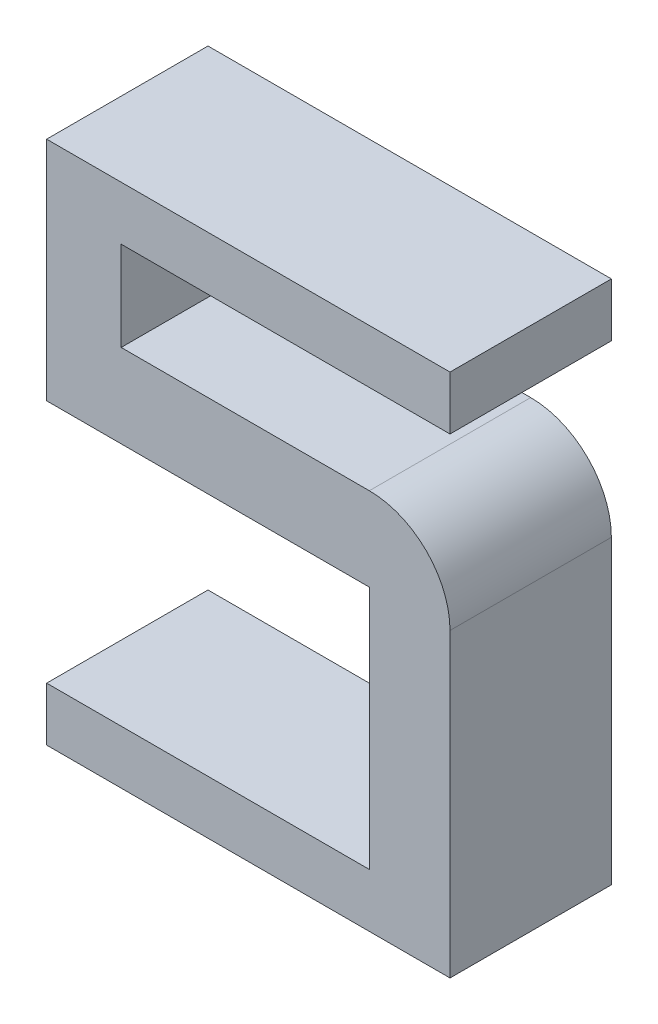
ISO-10303-21;
HEADER;
FILE_DESCRIPTION(('STEP AP214'),'2;1');
FILE_NAME('part.step','',(''),(''),'','','');
FILE_SCHEMA(('AUTOMOTIVE_DESIGN { 1 0 10303 214 1 1 1 1 }'));
ENDSEC;
DATA;
#1=APPLICATION_CONTEXT('core data for automotive mechanical design processes');
#2=APPLICATION_PROTOCOL_DEFINITION('international standard','automotive_design',2000,#1);
#3=PRODUCT_CONTEXT('',#1,'mechanical');
#4=PRODUCT('Part','Part','',(#3));
#5=PRODUCT_RELATED_PRODUCT_CATEGORY('part','',(#4));
#6=PRODUCT_DEFINITION_FORMATION('','',#4);
#7=PRODUCT_DEFINITION_CONTEXT('part definition',#1,'design');
#8=PRODUCT_DEFINITION('design','',#6,#7);
#9=PRODUCT_DEFINITION_SHAPE('','',#8);
#10=(LENGTH_UNIT() NAMED_UNIT(*) SI_UNIT(.MILLI.,.METRE.));
#11=(NAMED_UNIT(*) PLANE_ANGLE_UNIT() SI_UNIT($,.RADIAN.));
#12=(NAMED_UNIT(*) SI_UNIT($,.STERADIAN.) SOLID_ANGLE_UNIT());
#13=UNCERTAINTY_MEASURE_WITH_UNIT(LENGTH_MEASURE(1.E-05),#10,'distance_accuracy_value','');
#14=(GEOMETRIC_REPRESENTATION_CONTEXT(3) GLOBAL_UNCERTAINTY_ASSIGNED_CONTEXT((#13)) GLOBAL_UNIT_ASSIGNED_CONTEXT((#10,
#11,#12)) REPRESENTATION_CONTEXT('',''));
#15=CARTESIAN_POINT('',(0.,0.,0.));
#16=DIRECTION('',(0.,0.,1.));
#17=DIRECTION('',(1.,0.,0.));
#18=AXIS2_PLACEMENT_3D('',#15,#16,#17);
#19=CARTESIAN_POINT('',(130.834806192331,126.576014372164,20.));
#20=DIRECTION('',(-1.,0.,0.));
#21=DIRECTION('',(0.,0.,1.));
#22=AXIS2_PLACEMENT_3D('',#19,#20,#21);
#23=PLANE('',#22);
#24=DIRECTION('',(0.,1.,0.));
#25=VECTOR('',#24,1.);
#26=CARTESIAN_POINT('',(130.834806192331,126.576014372164,0.));
#27=LINE('',#26,#25);
#28=CARTESIAN_POINT('',(130.834806192331,126.576014372164,0.));
#29=VERTEX_POINT('',#28);
#30=CARTESIAN_POINT('',(130.834806192331,133.228481613816,0.));
#31=VERTEX_POINT('',#30);
#32=EDGE_CURVE('E160',#29,#31,#27,.T.);
#33=ORIENTED_EDGE('',*,*,#32,.T.);
#34=DIRECTION('',(0.,0.,-1.));
#35=VECTOR('',#34,1.);
#36=CARTESIAN_POINT('',(130.834806192331,133.228481613816,20.));
#37=LINE('',#36,#35);
#38=CARTESIAN_POINT('',(130.834806192331,133.228481613816,20.));
#39=VERTEX_POINT('',#38);
#40=EDGE_CURVE('E11',#39,#31,#37,.T.);
#41=ORIENTED_EDGE('',*,*,#40,.F.);
#42=DIRECTION('',(0.,1.,0.));
#43=VECTOR('',#42,1.);
#44=CARTESIAN_POINT('',(130.834806192331,126.576014372164,20.));
#45=LINE('',#44,#43);
#46=CARTESIAN_POINT('',(130.834806192331,126.576014372164,20.));
#47=VERTEX_POINT('',#46);
#48=EDGE_CURVE('E184',#47,#39,#45,.T.);
#49=ORIENTED_EDGE('',*,*,#48,.F.);
#50=DIRECTION('',(0.,0.,-1.));
#51=VECTOR('',#50,1.);
#52=CARTESIAN_POINT('',(130.834806192331,126.576014372164,20.));
#53=LINE('',#52,#51);
#54=EDGE_CURVE('E156',#47,#29,#53,.T.);
#55=ORIENTED_EDGE('',*,*,#54,.T.);
#56=EDGE_LOOP('',(#33,#41,#49,#55));
#57=FACE_BOUND('',#56,.T.);
#58=ADVANCED_FACE('F34',(#57),#23,.F.);
#59=CARTESIAN_POINT('',(130.834806192331,133.228481613816,20.));
#60=DIRECTION('',(0.,-1.,0.));
#61=DIRECTION('',(1.,0.,0.));
#62=AXIS2_PLACEMENT_3D('',#59,#60,#61);
#63=PLANE('',#62);
#64=DIRECTION('',(-1.,0.,0.));
#65=VECTOR('',#64,1.);
#66=CARTESIAN_POINT('',(130.834806192331,133.228481613816,0.));
#67=LINE('',#66,#65);
#68=CARTESIAN_POINT('',(80.8348061923312,133.228481613816,0.));
#69=VERTEX_POINT('',#68);
#70=EDGE_CURVE('E163',#31,#69,#67,.T.);
#71=ORIENTED_EDGE('',*,*,#70,.T.);
#72=DIRECTION('',(0.,0.,-1.));
#73=VECTOR('',#72,1.);
#74=CARTESIAN_POINT('',(80.8348061923312,133.228481613816,20.));
#75=LINE('',#74,#73);
#76=CARTESIAN_POINT('',(80.8348061923312,133.228481613816,20.));
#77=VERTEX_POINT('',#76);
#78=EDGE_CURVE('E42',#77,#69,#75,.T.);
#79=ORIENTED_EDGE('',*,*,#78,.F.);
#80=DIRECTION('',(-1.,0.,0.));
#81=VECTOR('',#80,1.);
#82=CARTESIAN_POINT('',(130.834806192331,133.228481613816,20.));
#83=LINE('',#82,#81);
#84=EDGE_CURVE('E108',#39,#77,#83,.T.);
#85=ORIENTED_EDGE('',*,*,#84,.F.);
#86=ORIENTED_EDGE('',*,*,#40,.T.);
#87=EDGE_LOOP('',(#71,#79,#85,#86));
#88=FACE_BOUND('',#87,.T.);
#89=ADVANCED_FACE('F267',(#88),#63,.F.);
#90=CARTESIAN_POINT('',(80.8348061923312,133.228481613816,20.));
#91=DIRECTION('',(1.,0.,0.));
#92=DIRECTION('',(0.,0.,-1.));
#93=AXIS2_PLACEMENT_3D('',#90,#91,#92);
#94=PLANE('',#93);
#95=DIRECTION('',(0.,-1.,0.));
#96=VECTOR('',#95,1.);
#97=CARTESIAN_POINT('',(80.8348061923312,133.228481613816,0.));
#98=LINE('',#97,#96);
#99=CARTESIAN_POINT('',(80.8348061923312,105.14028659351,0.));
#100=VERTEX_POINT('',#99);
#101=EDGE_CURVE('E165',#69,#100,#98,.T.);
#102=ORIENTED_EDGE('',*,*,#101,.T.);
#103=DIRECTION('',(0.,0.,-1.));
#104=VECTOR('',#103,1.);
#105=CARTESIAN_POINT('',(80.8348061923312,105.14028659351,20.));
#106=LINE('',#105,#104);
#107=CARTESIAN_POINT('',(80.8348061923312,105.14028659351,20.));
#108=VERTEX_POINT('',#107);
#109=EDGE_CURVE('E206',#108,#100,#106,.T.);
#110=ORIENTED_EDGE('',*,*,#109,.F.);
#111=DIRECTION('',(0.,-1.,0.));
#112=VECTOR('',#111,1.);
#113=CARTESIAN_POINT('',(80.8348061923312,133.228481613816,20.));
#114=LINE('',#113,#112);
#115=EDGE_CURVE('E214',#77,#108,#114,.T.);
#116=ORIENTED_EDGE('',*,*,#115,.F.);
#117=ORIENTED_EDGE('',*,*,#78,.T.);
#118=EDGE_LOOP('',(#102,#110,#116,#117));
#119=FACE_BOUND('',#118,.T.);
#120=ADVANCED_FACE('F212',(#119),#94,.F.);
#121=CARTESIAN_POINT('',(80.8348061923312,105.14028659351,20.));
#122=DIRECTION('',(0.,1.,0.));
#123=DIRECTION('',(0.,0.,1.));
#124=AXIS2_PLACEMENT_3D('',#121,#122,#123);
#125=PLANE('',#124);
#126=DIRECTION('',(1.,0.,0.));
#127=VECTOR('',#126,1.);
#128=CARTESIAN_POINT('',(80.8348061923312,105.14028659351,0.));
#129=LINE('',#128,#127);
#130=CARTESIAN_POINT('',(120.834806192331,105.14028659351,0.));
#131=VERTEX_POINT('',#130);
#132=EDGE_CURVE('E167',#100,#131,#129,.T.);
#133=ORIENTED_EDGE('',*,*,#132,.T.);
#134=DIRECTION('',(0.,0.,-1.));
#135=VECTOR('',#134,1.);
#136=CARTESIAN_POINT('',(120.834806192331,105.14028659351,20.));
#137=LINE('',#136,#135);
#138=CARTESIAN_POINT('',(120.834806192331,105.14028659351,20.));
#139=VERTEX_POINT('',#138);
#140=EDGE_CURVE('E203',#139,#131,#137,.T.);
#141=ORIENTED_EDGE('',*,*,#140,.F.);
#142=DIRECTION('',(1.,0.,0.));
#143=VECTOR('',#142,1.);
#144=CARTESIAN_POINT('',(80.8348061923312,105.14028659351,20.));
#145=LINE('',#144,#143);
#146=EDGE_CURVE('E232',#108,#139,#145,.T.);
#147=ORIENTED_EDGE('',*,*,#146,.F.);
#148=ORIENTED_EDGE('',*,*,#109,.T.);
#149=EDGE_LOOP('',(#133,#141,#147,#148));
#150=FACE_BOUND('',#149,.T.);
#151=ADVANCED_FACE('F223',(#150),#125,.F.);
#152=CARTESIAN_POINT('',(120.834806192331,105.14028659351,20.));
#153=DIRECTION('',(1.,0.,0.));
#154=DIRECTION('',(0.,0.,-1.));
#155=AXIS2_PLACEMENT_3D('',#152,#153,#154);
#156=PLANE('',#155);
#157=DIRECTION('',(0.,-1.,0.));
#158=VECTOR('',#157,1.);
#159=CARTESIAN_POINT('',(120.834806192331,105.14028659351,0.));
#160=LINE('',#159,#158);
#161=CARTESIAN_POINT('',(120.834806192331,74.8346024926532,0.));
#162=VERTEX_POINT('',#161);
#163=EDGE_CURVE('E169',#131,#162,#160,.T.);
#164=ORIENTED_EDGE('',*,*,#163,.T.);
#165=DIRECTION('',(0.,0.,-1.));
#166=VECTOR('',#165,1.);
#167=CARTESIAN_POINT('',(120.834806192331,74.8346024926532,20.));
#168=LINE('',#167,#166);
#169=CARTESIAN_POINT('',(120.834806192331,74.8346024926532,20.));
#170=VERTEX_POINT('',#169);
#171=EDGE_CURVE('E200',#170,#162,#168,.T.);
#172=ORIENTED_EDGE('',*,*,#171,.F.);
#173=DIRECTION('',(0.,-1.,0.));
#174=VECTOR('',#173,1.);
#175=CARTESIAN_POINT('',(120.834806192331,105.14028659351,20.));
#176=LINE('',#175,#174);
#177=EDGE_CURVE('E229',#139,#170,#176,.T.);
#178=ORIENTED_EDGE('',*,*,#177,.F.);
#179=ORIENTED_EDGE('',*,*,#140,.T.);
#180=EDGE_LOOP('',(#164,#172,#178,#179));
#181=FACE_BOUND('',#180,.T.);
#182=ADVANCED_FACE('F227',(#181),#156,.F.);
#183=CARTESIAN_POINT('',(120.834806192331,74.8346024926532,20.));
#184=DIRECTION('',(0.,-1.,0.));
#185=DIRECTION('',(0.,0.,-1.));
#186=AXIS2_PLACEMENT_3D('',#183,#184,#185);
#187=PLANE('',#186);
#188=DIRECTION('',(-1.,0.,0.));
#189=VECTOR('',#188,1.);
#190=CARTESIAN_POINT('',(120.834806192331,74.8346024926532,0.));
#191=LINE('',#190,#189);
#192=CARTESIAN_POINT('',(80.8348061923312,74.8346024926532,0.));
#193=VERTEX_POINT('',#192);
#194=EDGE_CURVE('E171',#162,#193,#191,.T.);
#195=ORIENTED_EDGE('',*,*,#194,.T.);
#196=DIRECTION('',(0.,0.,-1.));
#197=VECTOR('',#196,1.);
#198=CARTESIAN_POINT('',(80.8348061923312,74.8346024926532,20.));
#199=LINE('',#198,#197);
#200=CARTESIAN_POINT('',(80.8348061923312,74.8346024926532,20.));
#201=VERTEX_POINT('',#200);
#202=EDGE_CURVE('E197',#201,#193,#199,.T.);
#203=ORIENTED_EDGE('',*,*,#202,.F.);
#204=DIRECTION('',(-1.,0.,0.));
#205=VECTOR('',#204,1.);
#206=CARTESIAN_POINT('',(120.834806192331,74.8346024926532,20.));
#207=LINE('',#206,#205);
#208=EDGE_CURVE('E231',#170,#201,#207,.T.);
#209=ORIENTED_EDGE('',*,*,#208,.F.);
#210=ORIENTED_EDGE('',*,*,#171,.T.);
#211=EDGE_LOOP('',(#195,#203,#209,#210));
#212=FACE_BOUND('',#211,.T.);
#213=ADVANCED_FACE('F280',(#212),#187,.F.);
#214=CARTESIAN_POINT('',(80.8348061923312,74.8346024926532,20.));
#215=DIRECTION('',(1.,0.,0.));
#216=DIRECTION('',(0.,0.,-1.));
#217=AXIS2_PLACEMENT_3D('',#214,#215,#216);
#218=PLANE('',#217);
#219=DIRECTION('',(0.,-1.,0.));
#220=VECTOR('',#219,1.);
#221=CARTESIAN_POINT('',(80.8348061923312,74.8346024926532,0.));
#222=LINE('',#221,#220);
#223=CARTESIAN_POINT('',(80.8348061923312,68.1821352510018,0.));
#224=VERTEX_POINT('',#223);
#225=EDGE_CURVE('E173',#193,#224,#222,.T.);
#226=ORIENTED_EDGE('',*,*,#225,.T.);
#227=DIRECTION('',(0.,0.,-1.));
#228=VECTOR('',#227,1.);
#229=CARTESIAN_POINT('',(80.8348061923312,68.1821352510018,20.));
#230=LINE('',#229,#228);
#231=CARTESIAN_POINT('',(80.8348061923312,68.1821352510018,20.));
#232=VERTEX_POINT('',#231);
#233=EDGE_CURVE('E194',#232,#224,#230,.T.);
#234=ORIENTED_EDGE('',*,*,#233,.F.);
#235=DIRECTION('',(0.,-1.,0.));
#236=VECTOR('',#235,1.);
#237=CARTESIAN_POINT('',(80.8348061923312,74.8346024926532,20.));
#238=LINE('',#237,#236);
#239=EDGE_CURVE('E234',#201,#232,#238,.T.);
#240=ORIENTED_EDGE('',*,*,#239,.F.);
#241=ORIENTED_EDGE('',*,*,#202,.T.);
#242=EDGE_LOOP('',(#226,#234,#240,#241));
#243=FACE_BOUND('',#242,.T.);
#244=ADVANCED_FACE('F283',(#243),#218,.F.);
#245=CARTESIAN_POINT('',(80.8348061923312,68.1821352510018,20.));
#246=DIRECTION('',(0.,1.,0.));
#247=DIRECTION('',(0.,0.,1.));
#248=AXIS2_PLACEMENT_3D('',#245,#246,#247);
#249=PLANE('',#248);
#250=DIRECTION('',(1.,0.,0.));
#251=VECTOR('',#250,1.);
#252=CARTESIAN_POINT('',(80.8348061923312,68.1821352510018,0.));
#253=LINE('',#252,#251);
#254=CARTESIAN_POINT('',(130.834806192331,68.1821352510018,0.));
#255=VERTEX_POINT('',#254);
#256=EDGE_CURVE('E175',#224,#255,#253,.T.);
#257=ORIENTED_EDGE('',*,*,#256,.T.);
#258=DIRECTION('',(0.,0.,-1.));
#259=VECTOR('',#258,1.);
#260=CARTESIAN_POINT('',(130.834806192331,68.1821352510018,20.));
#261=LINE('',#260,#259);
#262=CARTESIAN_POINT('',(130.834806192331,68.1821352510018,20.));
#263=VERTEX_POINT('',#262);
#264=EDGE_CURVE('E191',#263,#255,#261,.T.);
#265=ORIENTED_EDGE('',*,*,#264,.F.);
#266=DIRECTION('',(1.,0.,0.));
#267=VECTOR('',#266,1.);
#268=CARTESIAN_POINT('',(80.8348061923312,68.1821352510018,20.));
#269=LINE('',#268,#267);
#270=EDGE_CURVE('E240',#232,#263,#269,.T.);
#271=ORIENTED_EDGE('',*,*,#270,.F.);
#272=ORIENTED_EDGE('',*,*,#233,.T.);
#273=EDGE_LOOP('',(#257,#265,#271,#272));
#274=FACE_BOUND('',#273,.T.);
#275=ADVANCED_FACE('F287',(#274),#249,.F.);
#276=CARTESIAN_POINT('',(130.834806192331,68.1821352510018,20.));
#277=DIRECTION('',(-1.,0.,0.));
#278=DIRECTION('',(0.,0.,1.));
#279=AXIS2_PLACEMENT_3D('',#276,#277,#278);
#280=PLANE('',#279);
#281=DIRECTION('',(0.,1.,0.));
#282=VECTOR('',#281,1.);
#283=CARTESIAN_POINT('',(130.834806192331,68.1821352510018,0.));
#284=LINE('',#283,#282);
#285=CARTESIAN_POINT('',(130.834806192331,105.488568969412,0.));
#286=VERTEX_POINT('',#285);
#287=EDGE_CURVE('E177',#255,#286,#284,.T.);
#288=ORIENTED_EDGE('',*,*,#287,.T.);
#289=DIRECTION('',(0.,0.,-1.));
#290=VECTOR('',#289,1.);
#291=CARTESIAN_POINT('',(130.834806192331,105.488568969412,20.));
#292=LINE('',#291,#290);
#293=CARTESIAN_POINT('',(130.834806192331,105.488568969412,20.));
#294=VERTEX_POINT('',#293);
#295=EDGE_CURVE('E188',#294,#286,#292,.T.);
#296=ORIENTED_EDGE('',*,*,#295,.F.);
#297=DIRECTION('',(0.,1.,0.));
#298=VECTOR('',#297,1.);
#299=CARTESIAN_POINT('',(130.834806192331,68.1821352510018,20.));
#300=LINE('',#299,#298);
#301=EDGE_CURVE('E242',#263,#294,#300,.T.);
#302=ORIENTED_EDGE('',*,*,#301,.F.);
#303=ORIENTED_EDGE('',*,*,#264,.T.);
#304=EDGE_LOOP('',(#288,#296,#302,#303));
#305=FACE_BOUND('',#304,.T.);
#306=ADVANCED_FACE('F248',(#305),#280,.F.);
#307=CARTESIAN_POINT('',(120.834806192331,105.488568969412,20.));
#308=DIRECTION('',(0.,0.,-1.));
#309=DIRECTION('',(-1.,0.,0.));
#310=AXIS2_PLACEMENT_3D('',#307,#308,#309);
#311=CYLINDRICAL_SURFACE('',#310,9.99999999999999);
#312=CARTESIAN_POINT('',(120.834806192331,105.488568969412,0.));
#313=DIRECTION('',(0.,0.,1.));
#314=DIRECTION('',(1.,0.,0.));
#315=AXIS2_PLACEMENT_3D('',#312,#313,#314);
#316=CIRCLE('',#315,9.99999999999999);
#317=CARTESIAN_POINT('',(120.834806192331,115.488568969412,0.));
#318=VERTEX_POINT('',#317);
#319=EDGE_CURVE('E179',#286,#318,#316,.T.);
#320=ORIENTED_EDGE('',*,*,#319,.T.);
#321=DIRECTION('',(0.,0.,-1.));
#322=VECTOR('',#321,1.);
#323=CARTESIAN_POINT('',(120.834806192331,115.488568969412,20.));
#324=LINE('',#323,#322);
#325=CARTESIAN_POINT('',(120.834806192331,115.488568969412,20.));
#326=VERTEX_POINT('',#325);
#327=EDGE_CURVE('E151',#326,#318,#324,.T.);
#328=ORIENTED_EDGE('',*,*,#327,.F.);
#329=CARTESIAN_POINT('',(120.834806192331,105.488568969412,20.));
#330=DIRECTION('',(0.,0.,1.));
#331=DIRECTION('',(1.,0.,0.));
#332=AXIS2_PLACEMENT_3D('',#329,#330,#331);
#333=CIRCLE('',#332,9.99999999999999);
#334=EDGE_CURVE('E142',#294,#326,#333,.T.);
#335=ORIENTED_EDGE('',*,*,#334,.F.);
#336=ORIENTED_EDGE('',*,*,#295,.T.);
#337=EDGE_LOOP('',(#320,#328,#335,#336));
#338=FACE_BOUND('',#337,.T.);
#339=ADVANCED_FACE('F252',(#338),#311,.T.);
#340=CARTESIAN_POINT('',(120.834806192331,115.488568969412,20.));
#341=DIRECTION('',(0.,-1.,0.));
#342=DIRECTION('',(0.,0.,-1.));
#343=AXIS2_PLACEMENT_3D('',#340,#341,#342);
#344=PLANE('',#343);
#345=DIRECTION('',(-1.,0.,0.));
#346=VECTOR('',#345,1.);
#347=CARTESIAN_POINT('',(120.834806192331,115.488568969412,0.));
#348=LINE('',#347,#346);
#349=CARTESIAN_POINT('',(90.0743440279582,115.488568969412,0.));
#350=VERTEX_POINT('',#349);
#351=EDGE_CURVE('E150',#318,#350,#348,.T.);
#352=ORIENTED_EDGE('',*,*,#351,.T.);
#353=DIRECTION('',(0.,0.,-1.));
#354=VECTOR('',#353,1.);
#355=CARTESIAN_POINT('',(90.0743440279582,115.488568969412,20.));
#356=LINE('',#355,#354);
#357=CARTESIAN_POINT('',(90.0743440279582,115.488568969412,20.));
#358=VERTEX_POINT('',#357);
#359=EDGE_CURVE('E147',#358,#350,#356,.T.);
#360=ORIENTED_EDGE('',*,*,#359,.F.);
#361=DIRECTION('',(-1.,0.,0.));
#362=VECTOR('',#361,1.);
#363=CARTESIAN_POINT('',(120.834806192331,115.488568969412,20.));
#364=LINE('',#363,#362);
#365=EDGE_CURVE('E136',#326,#358,#364,.T.);
#366=ORIENTED_EDGE('',*,*,#365,.F.);
#367=ORIENTED_EDGE('',*,*,#327,.T.);
#368=EDGE_LOOP('',(#352,#360,#366,#367));
#369=FACE_BOUND('',#368,.T.);
#370=ADVANCED_FACE('F148',(#369),#344,.F.);
#371=CARTESIAN_POINT('',(90.0743440279582,115.488568969412,20.));
#372=DIRECTION('',(-1.,0.,0.));
#373=DIRECTION('',(0.,0.,1.));
#374=AXIS2_PLACEMENT_3D('',#371,#372,#373);
#375=PLANE('',#374);
#376=DIRECTION('',(0.,1.,0.));
#377=VECTOR('',#376,1.);
#378=CARTESIAN_POINT('',(90.0743440279582,115.488568969412,0.));
#379=LINE('',#378,#377);
#380=CARTESIAN_POINT('',(90.0743440279582,126.576014372164,0.));
#381=VERTEX_POINT('',#380);
#382=EDGE_CURVE('E94',#350,#381,#379,.T.);
#383=ORIENTED_EDGE('',*,*,#382,.T.);
#384=DIRECTION('',(0.,0.,-1.));
#385=VECTOR('',#384,1.);
#386=CARTESIAN_POINT('',(90.0743440279582,126.576014372164,20.));
#387=LINE('',#386,#385);
#388=CARTESIAN_POINT('',(90.0743440279582,126.576014372164,20.));
#389=VERTEX_POINT('',#388);
#390=EDGE_CURVE('E152',#389,#381,#387,.T.);
#391=ORIENTED_EDGE('',*,*,#390,.F.);
#392=DIRECTION('',(0.,1.,0.));
#393=VECTOR('',#392,1.);
#394=CARTESIAN_POINT('',(90.0743440279582,115.488568969412,20.));
#395=LINE('',#394,#393);
#396=EDGE_CURVE('E140',#358,#389,#395,.T.);
#397=ORIENTED_EDGE('',*,*,#396,.F.);
#398=ORIENTED_EDGE('',*,*,#359,.T.);
#399=EDGE_LOOP('',(#383,#391,#397,#398));
#400=FACE_BOUND('',#399,.T.);
#401=ADVANCED_FACE('F154',(#400),#375,.F.);
#402=CARTESIAN_POINT('',(90.0743440279582,126.576014372164,20.));
#403=DIRECTION('',(0.,1.,0.));
#404=DIRECTION('',(0.,0.,1.));
#405=AXIS2_PLACEMENT_3D('',#402,#403,#404);
#406=PLANE('',#405);
#407=DIRECTION('',(1.,0.,0.));
#408=VECTOR('',#407,1.);
#409=CARTESIAN_POINT('',(90.0743440279582,126.576014372164,0.));
#410=LINE('',#409,#408);
#411=EDGE_CURVE('E100',#381,#29,#410,.T.);
#412=ORIENTED_EDGE('',*,*,#411,.T.);
#413=ORIENTED_EDGE('',*,*,#54,.F.);
#414=DIRECTION('',(1.,0.,0.));
#415=VECTOR('',#414,1.);
#416=CARTESIAN_POINT('',(90.0743440279582,126.576014372164,20.));
#417=LINE('',#416,#415);
#418=EDGE_CURVE('E50',#389,#47,#417,.T.);
#419=ORIENTED_EDGE('',*,*,#418,.F.);
#420=ORIENTED_EDGE('',*,*,#390,.T.);
#421=EDGE_LOOP('',(#412,#413,#419,#420));
#422=FACE_BOUND('',#421,.T.);
#423=ADVANCED_FACE('F256',(#422),#406,.F.);
#424=CARTESIAN_POINT('',(120.834806192331,105.488568969412,20.));
#425=DIRECTION('',(0.,0.,1.));
#426=DIRECTION('',(1.,0.,0.));
#427=AXIS2_PLACEMENT_3D('',#424,#425,#426);
#428=PLANE('',#427);
#429=ORIENTED_EDGE('',*,*,#48,.T.);
#430=ORIENTED_EDGE('',*,*,#84,.T.);
#431=ORIENTED_EDGE('',*,*,#115,.T.);
#432=ORIENTED_EDGE('',*,*,#146,.T.);
#433=ORIENTED_EDGE('',*,*,#177,.T.);
#434=ORIENTED_EDGE('',*,*,#208,.T.);
#435=ORIENTED_EDGE('',*,*,#239,.T.);
#436=ORIENTED_EDGE('',*,*,#270,.T.);
#437=ORIENTED_EDGE('',*,*,#301,.T.);
#438=ORIENTED_EDGE('',*,*,#334,.T.);
#439=ORIENTED_EDGE('',*,*,#365,.T.);
#440=ORIENTED_EDGE('',*,*,#396,.T.);
#441=ORIENTED_EDGE('',*,*,#418,.T.);
#442=EDGE_LOOP('',(#429,#430,#431,#432,#433,#434,#435,#436,#437,#438,#439,#440,#441));
#443=FACE_BOUND('',#442,.T.);
#444=ADVANCED_FACE('F138',(#443),#428,.T.);
#445=CARTESIAN_POINT('',(120.834806192331,105.488568969412,0.));
#446=DIRECTION('',(0.,0.,1.));
#447=DIRECTION('',(1.,0.,0.));
#448=AXIS2_PLACEMENT_3D('',#445,#446,#447);
#449=PLANE('',#448);
#450=ORIENTED_EDGE('',*,*,#32,.F.);
#451=ORIENTED_EDGE('',*,*,#411,.F.);
#452=ORIENTED_EDGE('',*,*,#382,.F.);
#453=ORIENTED_EDGE('',*,*,#351,.F.);
#454=ORIENTED_EDGE('',*,*,#319,.F.);
#455=ORIENTED_EDGE('',*,*,#287,.F.);
#456=ORIENTED_EDGE('',*,*,#256,.F.);
#457=ORIENTED_EDGE('',*,*,#225,.F.);
#458=ORIENTED_EDGE('',*,*,#194,.F.);
#459=ORIENTED_EDGE('',*,*,#163,.F.);
#460=ORIENTED_EDGE('',*,*,#132,.F.);
#461=ORIENTED_EDGE('',*,*,#101,.F.);
#462=ORIENTED_EDGE('',*,*,#70,.F.);
#463=EDGE_LOOP('',(#450,#451,#452,#453,#454,#455,#456,#457,#458,#459,#460,#461,#462));
#464=FACE_BOUND('',#463,.T.);
#465=ADVANCED_FACE('F218',(#464),#449,.F.);
#466=CLOSED_SHELL('',(#58,#89,#120,#151,#182,#213,#244,#275,#306,#339,#370,#401,#423,#444,#465));
#467=MANIFOLD_SOLID_BREP('B2',#466);
#468=ADVANCED_BREP_SHAPE_REPRESENTATION('',(#18,#467),#14);
#469=SHAPE_DEFINITION_REPRESENTATION(#9,#468);
ENDSEC;
END-ISO-10303-21;
